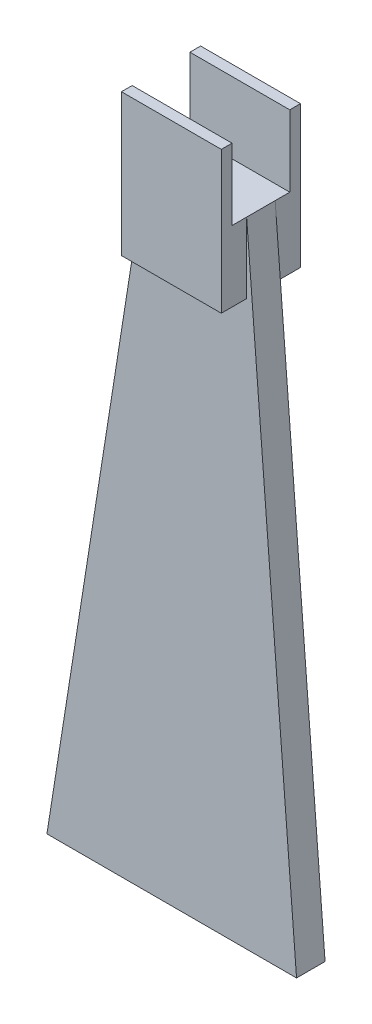
ISO-10303-21;
HEADER;
FILE_DESCRIPTION(('STEP AP214'),'2;1');
FILE_NAME('part.step','',(''),(''),'','','');
FILE_SCHEMA(('AUTOMOTIVE_DESIGN { 1 0 10303 214 1 1 1 1 }'));
ENDSEC;
DATA;
#1=APPLICATION_CONTEXT('core data for automotive mechanical design processes');
#2=APPLICATION_PROTOCOL_DEFINITION('international standard','automotive_design',2000,#1);
#3=PRODUCT_CONTEXT('',#1,'mechanical');
#4=PRODUCT('Part','Part','',(#3));
#5=PRODUCT_RELATED_PRODUCT_CATEGORY('part','',(#4));
#6=PRODUCT_DEFINITION_FORMATION('','',#4);
#7=PRODUCT_DEFINITION_CONTEXT('part definition',#1,'design');
#8=PRODUCT_DEFINITION('design','',#6,#7);
#9=PRODUCT_DEFINITION_SHAPE('','',#8);
#10=(LENGTH_UNIT() NAMED_UNIT(*) SI_UNIT(.MILLI.,.METRE.));
#11=(NAMED_UNIT(*) PLANE_ANGLE_UNIT() SI_UNIT($,.RADIAN.));
#12=(NAMED_UNIT(*) SI_UNIT($,.STERADIAN.) SOLID_ANGLE_UNIT());
#13=UNCERTAINTY_MEASURE_WITH_UNIT(LENGTH_MEASURE(1.E-05),#10,'distance_accuracy_value','');
#14=(GEOMETRIC_REPRESENTATION_CONTEXT(3) GLOBAL_UNCERTAINTY_ASSIGNED_CONTEXT((#13)) GLOBAL_UNIT_ASSIGNED_CONTEXT((#10,
#11,#12)) REPRESENTATION_CONTEXT('',''));
#15=CARTESIAN_POINT('',(0.,0.,0.));
#16=DIRECTION('',(0.,0.,1.));
#17=DIRECTION('',(1.,0.,0.));
#18=AXIS2_PLACEMENT_3D('',#15,#16,#17);
#19=CARTESIAN_POINT('',(-59.,177.8,4.));
#20=DIRECTION('',(0.,-1.,0.));
#21=DIRECTION('',(0.,0.,-1.));
#22=AXIS2_PLACEMENT_3D('',#19,#20,#21);
#23=PLANE('',#22);
#24=DIRECTION('',(1.,0.,0.));
#25=VECTOR('',#24,1.);
#26=CARTESIAN_POINT('',(-87.,177.8,-8.1));
#27=LINE('',#26,#25);
#28=CARTESIAN_POINT('',(-87.,177.8,-8.1));
#29=VERTEX_POINT('',#28);
#30=CARTESIAN_POINT('',(-59.,177.8,-8.1));
#31=VERTEX_POINT('',#30);
#32=EDGE_CURVE('E57',#29,#31,#27,.T.);
#33=ORIENTED_EDGE('',*,*,#32,.F.);
#34=DIRECTION('',(0.,0.,1.));
#35=VECTOR('',#34,1.);
#36=CARTESIAN_POINT('',(-87.,177.8,-11.1));
#37=LINE('',#36,#35);
#38=CARTESIAN_POINT('',(-87.,177.8,-4.));
#39=VERTEX_POINT('',#38);
#40=EDGE_CURVE('E163',#29,#39,#37,.T.);
#41=ORIENTED_EDGE('',*,*,#40,.T.);
#42=DIRECTION('',(0.,0.,-1.));
#43=VECTOR('',#42,1.);
#44=CARTESIAN_POINT('',(-87.,177.8,4.));
#45=LINE('',#44,#43);
#46=CARTESIAN_POINT('',(-87.,177.8,4.));
#47=VERTEX_POINT('',#46);
#48=EDGE_CURVE('E234',#47,#39,#45,.T.);
#49=ORIENTED_EDGE('',*,*,#48,.F.);
#50=CARTESIAN_POINT('',(-87.,177.8,8.1));
#51=VERTEX_POINT('',#50);
#52=EDGE_CURVE('E192',#47,#51,#37,.T.);
#53=ORIENTED_EDGE('',*,*,#52,.T.);
#54=DIRECTION('',(-1.,0.,0.));
#55=VECTOR('',#54,1.);
#56=CARTESIAN_POINT('',(-87.,177.8,8.1));
#57=LINE('',#56,#55);
#58=CARTESIAN_POINT('',(-59.,177.8,8.1));
#59=VERTEX_POINT('',#58);
#60=EDGE_CURVE('E62',#59,#51,#57,.T.);
#61=ORIENTED_EDGE('',*,*,#60,.F.);
#62=DIRECTION('',(0.,0.,-1.));
#63=VECTOR('',#62,1.);
#64=CARTESIAN_POINT('',(-59.,177.8,11.1));
#65=LINE('',#64,#63);
#66=CARTESIAN_POINT('',(-59.,177.8,4.));
#67=VERTEX_POINT('',#66);
#68=EDGE_CURVE('E194',#59,#67,#65,.T.);
#69=ORIENTED_EDGE('',*,*,#68,.T.);
#70=DIRECTION('',(0.,0.,-1.));
#71=VECTOR('',#70,1.);
#72=CARTESIAN_POINT('',(-59.,177.8,4.));
#73=LINE('',#72,#71);
#74=CARTESIAN_POINT('',(-59.,177.8,-4.));
#75=VERTEX_POINT('',#74);
#76=EDGE_CURVE('E241',#67,#75,#73,.T.);
#77=ORIENTED_EDGE('',*,*,#76,.T.);
#78=EDGE_CURVE('E189',#75,#31,#65,.T.);
#79=ORIENTED_EDGE('',*,*,#78,.T.);
#80=EDGE_LOOP('',(#33,#41,#49,#53,#61,#69,#77,#79));
#81=FACE_BOUND('',#80,.T.);
#82=ADVANCED_FACE('F41',(#81),#23,.F.);
#83=CARTESIAN_POINT('',(0.,0.,4.));
#84=DIRECTION('',(0.,0.,1.));
#85=DIRECTION('',(1.,0.,0.));
#86=AXIS2_PLACEMENT_3D('',#83,#84,#85);
#87=PLANE('',#86);
#88=DIRECTION('',(-1.,0.,0.));
#89=VECTOR('',#88,1.);
#90=CARTESIAN_POINT('',(0.,158.,4.));
#91=LINE('',#90,#89);
#92=CARTESIAN_POINT('',(-59.,158.,4.));
#93=VERTEX_POINT('',#92);
#94=CARTESIAN_POINT('',(-87.,158.,4.));
#95=VERTEX_POINT('',#94);
#96=EDGE_CURVE('E213',#93,#95,#91,.T.);
#97=ORIENTED_EDGE('',*,*,#96,.T.);
#98=DIRECTION('',(0.,1.,0.));
#99=VECTOR('',#98,1.);
#100=CARTESIAN_POINT('',(-87.,0.,4.));
#101=LINE('',#100,#99);
#102=EDGE_CURVE('E218',#95,#47,#101,.T.);
#103=ORIENTED_EDGE('',*,*,#102,.T.);
#104=DIRECTION('',(-0.155563141844365,-0.987825950711718,0.));
#105=VECTOR('',#104,1.);
#106=CARTESIAN_POINT('',(-87.,177.8,4.));
#107=LINE('',#106,#105);
#108=CARTESIAN_POINT('',(-115.,0.,4.));
#109=VERTEX_POINT('',#108);
#110=EDGE_CURVE('E224',#47,#109,#107,.T.);
#111=ORIENTED_EDGE('',*,*,#110,.T.);
#112=DIRECTION('',(1.,0.,0.));
#113=VECTOR('',#112,1.);
#114=CARTESIAN_POINT('',(-115.,0.,4.));
#115=LINE('',#114,#113);
#116=CARTESIAN_POINT('',(-45.,0.,4.));
#117=VERTEX_POINT('',#116);
#118=EDGE_CURVE('E226',#109,#117,#115,.T.);
#119=ORIENTED_EDGE('',*,*,#118,.T.);
#120=DIRECTION('',(-0.0784971917150789,0.996914334781503,0.));
#121=VECTOR('',#120,1.);
#122=CARTESIAN_POINT('',(-45.,0.,4.));
#123=LINE('',#122,#121);
#124=EDGE_CURVE('E228',#117,#67,#123,.T.);
#125=ORIENTED_EDGE('',*,*,#124,.T.);
#126=DIRECTION('',(0.,-1.,0.));
#127=VECTOR('',#126,1.);
#128=CARTESIAN_POINT('',(-59.,0.,4.));
#129=LINE('',#128,#127);
#130=EDGE_CURVE('E216',#67,#93,#129,.T.);
#131=ORIENTED_EDGE('',*,*,#130,.T.);
#132=EDGE_LOOP('',(#97,#103,#111,#119,#125,#131));
#133=FACE_BOUND('',#132,.T.);
#134=ADVANCED_FACE('F293',(#133),#87,.T.);
#135=CARTESIAN_POINT('',(0.,0.,-4.));
#136=DIRECTION('',(0.,0.,1.));
#137=DIRECTION('',(1.,0.,0.));
#138=AXIS2_PLACEMENT_3D('',#135,#136,#137);
#139=PLANE('',#138);
#140=DIRECTION('',(0.,1.,0.));
#141=VECTOR('',#140,1.);
#142=CARTESIAN_POINT('',(-87.,0.,-4.));
#143=LINE('',#142,#141);
#144=CARTESIAN_POINT('',(-87.,158.,-4.));
#145=VERTEX_POINT('',#144);
#146=EDGE_CURVE('E11',#145,#39,#143,.T.);
#147=ORIENTED_EDGE('',*,*,#146,.F.);
#148=DIRECTION('',(-1.,0.,0.));
#149=VECTOR('',#148,1.);
#150=CARTESIAN_POINT('',(0.,158.,-4.));
#151=LINE('',#150,#149);
#152=CARTESIAN_POINT('',(-59.,158.,-4.));
#153=VERTEX_POINT('',#152);
#154=EDGE_CURVE('E248',#153,#145,#151,.T.);
#155=ORIENTED_EDGE('',*,*,#154,.F.);
#156=DIRECTION('',(0.,-1.,0.));
#157=VECTOR('',#156,1.);
#158=CARTESIAN_POINT('',(-59.,0.,-4.));
#159=LINE('',#158,#157);
#160=EDGE_CURVE('E47',#75,#153,#159,.T.);
#161=ORIENTED_EDGE('',*,*,#160,.F.);
#162=DIRECTION('',(-0.0784971917150789,0.996914334781503,0.));
#163=VECTOR('',#162,1.);
#164=CARTESIAN_POINT('',(-45.,0.,-4.));
#165=LINE('',#164,#163);
#166=CARTESIAN_POINT('',(-45.,0.,-4.));
#167=VERTEX_POINT('',#166);
#168=EDGE_CURVE('E230',#167,#75,#165,.T.);
#169=ORIENTED_EDGE('',*,*,#168,.F.);
#170=DIRECTION('',(1.,0.,0.));
#171=VECTOR('',#170,1.);
#172=CARTESIAN_POINT('',(-115.,0.,-4.));
#173=LINE('',#172,#171);
#174=CARTESIAN_POINT('',(-115.,0.,-4.));
#175=VERTEX_POINT('',#174);
#176=EDGE_CURVE('E233',#175,#167,#173,.T.);
#177=ORIENTED_EDGE('',*,*,#176,.F.);
#178=DIRECTION('',(-0.155563141844365,-0.987825950711718,0.));
#179=VECTOR('',#178,1.);
#180=CARTESIAN_POINT('',(-87.,177.8,-4.));
#181=LINE('',#180,#179);
#182=EDGE_CURVE('E225',#39,#175,#181,.T.);
#183=ORIENTED_EDGE('',*,*,#182,.F.);
#184=EDGE_LOOP('',(#147,#155,#161,#169,#177,#183));
#185=FACE_BOUND('',#184,.T.);
#186=ADVANCED_FACE('F266',(#185),#139,.F.);
#187=CARTESIAN_POINT('',(-87.,177.8,4.));
#188=DIRECTION('',(0.987825950711718,-0.155563141844365,0.));
#189=DIRECTION('',(0.155563141844365,0.987825950711718,0.));
#190=AXIS2_PLACEMENT_3D('',#187,#188,#189);
#191=PLANE('',#190);
#192=ORIENTED_EDGE('',*,*,#182,.T.);
#193=DIRECTION('',(0.,0.,-1.));
#194=VECTOR('',#193,1.);
#195=CARTESIAN_POINT('',(-115.,0.,4.));
#196=LINE('',#195,#194);
#197=EDGE_CURVE('E249',#109,#175,#196,.T.);
#198=ORIENTED_EDGE('',*,*,#197,.F.);
#199=ORIENTED_EDGE('',*,*,#110,.F.);
#200=ORIENTED_EDGE('',*,*,#48,.T.);
#201=EDGE_LOOP('',(#192,#198,#199,#200));
#202=FACE_BOUND('',#201,.T.);
#203=ADVANCED_FACE('F43',(#202),#191,.F.);
#204=CARTESIAN_POINT('',(-115.,0.,4.));
#205=DIRECTION('',(0.,1.,0.));
#206=DIRECTION('',(0.,0.,1.));
#207=AXIS2_PLACEMENT_3D('',#204,#205,#206);
#208=PLANE('',#207);
#209=ORIENTED_EDGE('',*,*,#176,.T.);
#210=DIRECTION('',(0.,0.,-1.));
#211=VECTOR('',#210,1.);
#212=CARTESIAN_POINT('',(-45.,0.,4.));
#213=LINE('',#212,#211);
#214=EDGE_CURVE('E243',#117,#167,#213,.T.);
#215=ORIENTED_EDGE('',*,*,#214,.F.);
#216=ORIENTED_EDGE('',*,*,#118,.F.);
#217=ORIENTED_EDGE('',*,*,#197,.T.);
#218=EDGE_LOOP('',(#209,#215,#216,#217));
#219=FACE_BOUND('',#218,.T.);
#220=ADVANCED_FACE('F291',(#219),#208,.F.);
#221=CARTESIAN_POINT('',(-45.,0.,4.));
#222=DIRECTION('',(-0.996914334781503,-0.078497191715079,0.));
#223=DIRECTION('',(0.0784971917150789,-0.996914334781503,0.));
#224=AXIS2_PLACEMENT_3D('',#221,#222,#223);
#225=PLANE('',#224);
#226=ORIENTED_EDGE('',*,*,#168,.T.);
#227=ORIENTED_EDGE('',*,*,#76,.F.);
#228=ORIENTED_EDGE('',*,*,#124,.F.);
#229=ORIENTED_EDGE('',*,*,#214,.T.);
#230=EDGE_LOOP('',(#226,#227,#228,#229));
#231=FACE_BOUND('',#230,.T.);
#232=ADVANCED_FACE('F288',(#231),#225,.F.);
#233=CARTESIAN_POINT('',(-59.,177.8,-11.1));
#234=DIRECTION('',(0.,0.,1.));
#235=DIRECTION('',(1.,0.,0.));
#236=AXIS2_PLACEMENT_3D('',#233,#234,#235);
#237=PLANE('',#236);
#238=DIRECTION('',(-1.,0.,0.));
#239=VECTOR('',#238,1.);
#240=CARTESIAN_POINT('',(-59.,158.,-11.1));
#241=LINE('',#240,#239);
#242=CARTESIAN_POINT('',(-59.,158.,-11.1));
#243=VERTEX_POINT('',#242);
#244=CARTESIAN_POINT('',(-87.,158.,-11.1));
#245=VERTEX_POINT('',#244);
#246=EDGE_CURVE('E203',#243,#245,#241,.T.);
#247=ORIENTED_EDGE('',*,*,#246,.T.);
#248=DIRECTION('',(0.,-1.,0.));
#249=VECTOR('',#248,1.);
#250=CARTESIAN_POINT('',(-87.,177.8,-11.1));
#251=LINE('',#250,#249);
#252=CARTESIAN_POINT('',(-87.,197.8,-11.1));
#253=VERTEX_POINT('',#252);
#254=EDGE_CURVE('E195',#253,#245,#251,.T.);
#255=ORIENTED_EDGE('',*,*,#254,.F.);
#256=DIRECTION('',(-1.,0.,0.));
#257=VECTOR('',#256,1.);
#258=CARTESIAN_POINT('',(-59.,197.8,-11.1));
#259=LINE('',#258,#257);
#260=CARTESIAN_POINT('',(-59.,197.8,-11.1));
#261=VERTEX_POINT('',#260);
#262=EDGE_CURVE('E158',#261,#253,#259,.T.);
#263=ORIENTED_EDGE('',*,*,#262,.F.);
#264=DIRECTION('',(0.,-1.,0.));
#265=VECTOR('',#264,1.);
#266=CARTESIAN_POINT('',(-59.,177.8,-11.1));
#267=LINE('',#266,#265);
#268=EDGE_CURVE('E204',#261,#243,#267,.T.);
#269=ORIENTED_EDGE('',*,*,#268,.T.);
#270=EDGE_LOOP('',(#247,#255,#263,#269));
#271=FACE_BOUND('',#270,.T.);
#272=ADVANCED_FACE('F262',(#271),#237,.F.);
#273=CARTESIAN_POINT('',(0.,158.,0.));
#274=DIRECTION('',(0.,1.,0.));
#275=DIRECTION('',(0.,0.,1.));
#276=AXIS2_PLACEMENT_3D('',#273,#274,#275);
#277=PLANE('',#276);
#278=DIRECTION('',(0.,0.,-1.));
#279=VECTOR('',#278,1.);
#280=CARTESIAN_POINT('',(-59.,158.,11.1));
#281=LINE('',#280,#279);
#282=EDGE_CURVE('E197',#153,#243,#281,.T.);
#283=ORIENTED_EDGE('',*,*,#282,.F.);
#284=ORIENTED_EDGE('',*,*,#154,.T.);
#285=DIRECTION('',(0.,0.,1.));
#286=VECTOR('',#285,1.);
#287=CARTESIAN_POINT('',(-87.,158.,-11.1));
#288=LINE('',#287,#286);
#289=EDGE_CURVE('E170',#245,#145,#288,.T.);
#290=ORIENTED_EDGE('',*,*,#289,.F.);
#291=ORIENTED_EDGE('',*,*,#246,.F.);
#292=EDGE_LOOP('',(#283,#284,#290,#291));
#293=FACE_BOUND('',#292,.T.);
#294=ADVANCED_FACE('F261',(#293),#277,.F.);
#295=CARTESIAN_POINT('',(-59.,177.8,11.1));
#296=DIRECTION('',(-1.,0.,0.));
#297=DIRECTION('',(0.,0.,1.));
#298=AXIS2_PLACEMENT_3D('',#295,#296,#297);
#299=PLANE('',#298);
#300=ORIENTED_EDGE('',*,*,#78,.F.);
#301=ORIENTED_EDGE('',*,*,#160,.T.);
#302=ORIENTED_EDGE('',*,*,#282,.T.);
#303=ORIENTED_EDGE('',*,*,#268,.F.);
#304=DIRECTION('',(0.,0.,-1.));
#305=VECTOR('',#304,1.);
#306=CARTESIAN_POINT('',(-59.,197.8,-8.1));
#307=LINE('',#306,#305);
#308=CARTESIAN_POINT('',(-59.,197.8,-8.1));
#309=VERTEX_POINT('',#308);
#310=EDGE_CURVE('E151',#309,#261,#307,.T.);
#311=ORIENTED_EDGE('',*,*,#310,.F.);
#312=DIRECTION('',(0.,-1.,0.));
#313=VECTOR('',#312,1.);
#314=CARTESIAN_POINT('',(-59.,197.8,-8.1));
#315=LINE('',#314,#313);
#316=EDGE_CURVE('E150',#309,#31,#315,.T.);
#317=ORIENTED_EDGE('',*,*,#316,.T.);
#318=EDGE_LOOP('',(#300,#301,#302,#303,#311,#317));
#319=FACE_BOUND('',#318,.T.);
#320=ADVANCED_FACE('F258',(#319),#299,.F.);
#321=CARTESIAN_POINT('',(-87.,177.8,-11.1));
#322=DIRECTION('',(1.,0.,0.));
#323=DIRECTION('',(0.,0.,-1.));
#324=AXIS2_PLACEMENT_3D('',#321,#322,#323);
#325=PLANE('',#324);
#326=ORIENTED_EDGE('',*,*,#289,.T.);
#327=ORIENTED_EDGE('',*,*,#146,.T.);
#328=ORIENTED_EDGE('',*,*,#40,.F.);
#329=DIRECTION('',(0.,-1.,0.));
#330=VECTOR('',#329,1.);
#331=CARTESIAN_POINT('',(-87.,197.8,-8.1));
#332=LINE('',#331,#330);
#333=CARTESIAN_POINT('',(-87.,197.8,-8.1));
#334=VERTEX_POINT('',#333);
#335=EDGE_CURVE('E144',#334,#29,#332,.T.);
#336=ORIENTED_EDGE('',*,*,#335,.F.);
#337=DIRECTION('',(0.,0.,1.));
#338=VECTOR('',#337,1.);
#339=CARTESIAN_POINT('',(-87.,197.8,-11.1));
#340=LINE('',#339,#338);
#341=EDGE_CURVE('E155',#253,#334,#340,.T.);
#342=ORIENTED_EDGE('',*,*,#341,.F.);
#343=ORIENTED_EDGE('',*,*,#254,.T.);
#344=EDGE_LOOP('',(#326,#327,#328,#336,#342,#343));
#345=FACE_BOUND('',#344,.T.);
#346=ADVANCED_FACE('F162',(#345),#325,.F.);
#347=ORIENTED_EDGE('',*,*,#102,.F.);
#348=CARTESIAN_POINT('',(-87.,158.,11.1));
#349=VERTEX_POINT('',#348);
#350=EDGE_CURVE('E164',#95,#349,#288,.T.);
#351=ORIENTED_EDGE('',*,*,#350,.T.);
#352=DIRECTION('',(0.,-1.,0.));
#353=VECTOR('',#352,1.);
#354=CARTESIAN_POINT('',(-87.,177.8,11.1));
#355=LINE('',#354,#353);
#356=CARTESIAN_POINT('',(-87.,197.8,11.1));
#357=VERTEX_POINT('',#356);
#358=EDGE_CURVE('E209',#357,#349,#355,.T.);
#359=ORIENTED_EDGE('',*,*,#358,.F.);
#360=DIRECTION('',(0.,0.,1.));
#361=VECTOR('',#360,1.);
#362=CARTESIAN_POINT('',(-87.,197.8,11.1));
#363=LINE('',#362,#361);
#364=CARTESIAN_POINT('',(-87.,197.8,8.1));
#365=VERTEX_POINT('',#364);
#366=EDGE_CURVE('E178',#365,#357,#363,.T.);
#367=ORIENTED_EDGE('',*,*,#366,.F.);
#368=DIRECTION('',(0.,-1.,0.));
#369=VECTOR('',#368,1.);
#370=CARTESIAN_POINT('',(-87.,197.8,8.1));
#371=LINE('',#370,#369);
#372=EDGE_CURVE('E174',#365,#51,#371,.T.);
#373=ORIENTED_EDGE('',*,*,#372,.T.);
#374=ORIENTED_EDGE('',*,*,#52,.F.);
#375=EDGE_LOOP('',(#347,#351,#359,#367,#373,#374));
#376=FACE_BOUND('',#375,.T.);
#377=ADVANCED_FACE('F276',(#376),#325,.F.);
#378=CARTESIAN_POINT('',(-87.,177.8,11.1));
#379=DIRECTION('',(0.,0.,-1.));
#380=DIRECTION('',(-1.,0.,0.));
#381=AXIS2_PLACEMENT_3D('',#378,#379,#380);
#382=PLANE('',#381);
#383=DIRECTION('',(1.,0.,0.));
#384=VECTOR('',#383,1.);
#385=CARTESIAN_POINT('',(-87.,158.,11.1));
#386=LINE('',#385,#384);
#387=CARTESIAN_POINT('',(-59.,158.,11.1));
#388=VERTEX_POINT('',#387);
#389=EDGE_CURVE('E193',#349,#388,#386,.T.);
#390=ORIENTED_EDGE('',*,*,#389,.T.);
#391=DIRECTION('',(0.,-1.,0.));
#392=VECTOR('',#391,1.);
#393=CARTESIAN_POINT('',(-59.,177.8,11.1));
#394=LINE('',#393,#392);
#395=CARTESIAN_POINT('',(-59.,197.8,11.1));
#396=VERTEX_POINT('',#395);
#397=EDGE_CURVE('E210',#396,#388,#394,.T.);
#398=ORIENTED_EDGE('',*,*,#397,.F.);
#399=DIRECTION('',(1.,0.,0.));
#400=VECTOR('',#399,1.);
#401=CARTESIAN_POINT('',(-59.,197.8,11.1));
#402=LINE('',#401,#400);
#403=EDGE_CURVE('E184',#357,#396,#402,.T.);
#404=ORIENTED_EDGE('',*,*,#403,.F.);
#405=ORIENTED_EDGE('',*,*,#358,.T.);
#406=EDGE_LOOP('',(#390,#398,#404,#405));
#407=FACE_BOUND('',#406,.T.);
#408=ADVANCED_FACE('F302',(#407),#382,.F.);
#409=ORIENTED_EDGE('',*,*,#130,.F.);
#410=ORIENTED_EDGE('',*,*,#68,.F.);
#411=DIRECTION('',(0.,-1.,0.));
#412=VECTOR('',#411,1.);
#413=CARTESIAN_POINT('',(-59.,197.8,8.1));
#414=LINE('',#413,#412);
#415=CARTESIAN_POINT('',(-59.,197.8,8.1));
#416=VERTEX_POINT('',#415);
#417=EDGE_CURVE('E175',#416,#59,#414,.T.);
#418=ORIENTED_EDGE('',*,*,#417,.F.);
#419=DIRECTION('',(0.,0.,-1.));
#420=VECTOR('',#419,1.);
#421=CARTESIAN_POINT('',(-59.,197.8,8.1));
#422=LINE('',#421,#420);
#423=EDGE_CURVE('E185',#396,#416,#422,.T.);
#424=ORIENTED_EDGE('',*,*,#423,.F.);
#425=ORIENTED_EDGE('',*,*,#397,.T.);
#426=EDGE_CURVE('E196',#388,#93,#281,.T.);
#427=ORIENTED_EDGE('',*,*,#426,.T.);
#428=EDGE_LOOP('',(#409,#410,#418,#424,#425,#427));
#429=FACE_BOUND('',#428,.T.);
#430=ADVANCED_FACE('F287',(#429),#299,.F.);
#431=ORIENTED_EDGE('',*,*,#96,.F.);
#432=ORIENTED_EDGE('',*,*,#426,.F.);
#433=ORIENTED_EDGE('',*,*,#389,.F.);
#434=ORIENTED_EDGE('',*,*,#350,.F.);
#435=EDGE_LOOP('',(#431,#432,#433,#434));
#436=FACE_BOUND('',#435,.T.);
#437=ADVANCED_FACE('F298',(#436),#277,.F.);
#438=CARTESIAN_POINT('',(-87.,197.8,8.1));
#439=DIRECTION('',(0.,0.,1.));
#440=DIRECTION('',(1.,0.,0.));
#441=AXIS2_PLACEMENT_3D('',#438,#439,#440);
#442=PLANE('',#441);
#443=ORIENTED_EDGE('',*,*,#60,.T.);
#444=ORIENTED_EDGE('',*,*,#372,.F.);
#445=DIRECTION('',(-1.,0.,0.));
#446=VECTOR('',#445,1.);
#447=CARTESIAN_POINT('',(-87.,197.8,8.1));
#448=LINE('',#447,#446);
#449=EDGE_CURVE('E180',#416,#365,#448,.T.);
#450=ORIENTED_EDGE('',*,*,#449,.F.);
#451=ORIENTED_EDGE('',*,*,#417,.T.);
#452=EDGE_LOOP('',(#443,#444,#450,#451));
#453=FACE_BOUND('',#452,.T.);
#454=ADVANCED_FACE('F274',(#453),#442,.F.);
#455=CARTESIAN_POINT('',(0.,197.8,0.));
#456=DIRECTION('',(0.,-1.,0.));
#457=DIRECTION('',(0.,0.,-1.));
#458=AXIS2_PLACEMENT_3D('',#455,#456,#457);
#459=PLANE('',#458);
#460=ORIENTED_EDGE('',*,*,#366,.T.);
#461=ORIENTED_EDGE('',*,*,#403,.T.);
#462=ORIENTED_EDGE('',*,*,#423,.T.);
#463=ORIENTED_EDGE('',*,*,#449,.T.);
#464=EDGE_LOOP('',(#460,#461,#462,#463));
#465=FACE_BOUND('',#464,.T.);
#466=ADVANCED_FACE('F285',(#465),#459,.F.);
#467=CARTESIAN_POINT('',(-87.,197.8,-8.1));
#468=DIRECTION('',(0.,0.,-1.));
#469=DIRECTION('',(-1.,0.,0.));
#470=AXIS2_PLACEMENT_3D('',#467,#468,#469);
#471=PLANE('',#470);
#472=ORIENTED_EDGE('',*,*,#32,.T.);
#473=ORIENTED_EDGE('',*,*,#316,.F.);
#474=DIRECTION('',(1.,0.,0.));
#475=VECTOR('',#474,1.);
#476=CARTESIAN_POINT('',(-87.,197.8,-8.1));
#477=LINE('',#476,#475);
#478=EDGE_CURVE('E143',#334,#309,#477,.T.);
#479=ORIENTED_EDGE('',*,*,#478,.F.);
#480=ORIENTED_EDGE('',*,*,#335,.T.);
#481=EDGE_LOOP('',(#472,#473,#479,#480));
#482=FACE_BOUND('',#481,.T.);
#483=ADVANCED_FACE('F141',(#482),#471,.F.);
#484=CARTESIAN_POINT('',(0.,197.8,0.));
#485=DIRECTION('',(0.,1.,0.));
#486=DIRECTION('',(0.,0.,1.));
#487=AXIS2_PLACEMENT_3D('',#484,#485,#486);
#488=PLANE('',#487);
#489=ORIENTED_EDGE('',*,*,#341,.T.);
#490=ORIENTED_EDGE('',*,*,#478,.T.);
#491=ORIENTED_EDGE('',*,*,#310,.T.);
#492=ORIENTED_EDGE('',*,*,#262,.T.);
#493=EDGE_LOOP('',(#489,#490,#491,#492));
#494=FACE_BOUND('',#493,.T.);
#495=ADVANCED_FACE('F156',(#494),#488,.T.);
#496=CLOSED_SHELL('',(#82,#134,#186,#203,#220,#232,#272,#294,#320,#346,#377,#408,#430,#437,#454,
#466,#483,#495));
#497=MANIFOLD_SOLID_BREP('B2',#496);
#498=ADVANCED_BREP_SHAPE_REPRESENTATION('',(#18,#497),#14);
#499=SHAPE_DEFINITION_REPRESENTATION(#9,#498);
ENDSEC;
END-ISO-10303-21;
